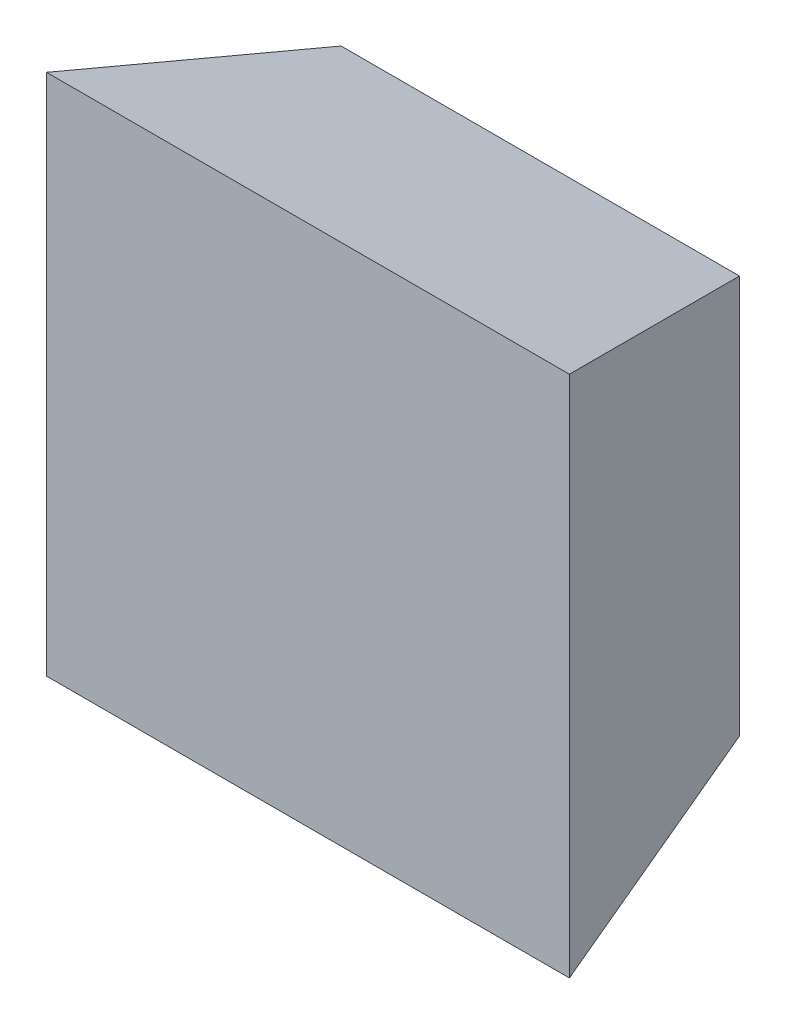
ISO-10303-21;
HEADER;
FILE_DESCRIPTION(('STEP AP214'),'2;1');
FILE_NAME('part.step','',(''),(''),'','','');
FILE_SCHEMA(('AUTOMOTIVE_DESIGN { 1 0 10303 214 1 1 1 1 }'));
ENDSEC;
DATA;
#1=APPLICATION_CONTEXT('core data for automotive mechanical design processes');
#2=APPLICATION_PROTOCOL_DEFINITION('international standard','automotive_design',2000,#1);
#3=PRODUCT_CONTEXT('',#1,'mechanical');
#4=PRODUCT('Part','Part','',(#3));
#5=PRODUCT_RELATED_PRODUCT_CATEGORY('part','',(#4));
#6=PRODUCT_DEFINITION_FORMATION('','',#4);
#7=PRODUCT_DEFINITION_CONTEXT('part definition',#1,'design');
#8=PRODUCT_DEFINITION('design','',#6,#7);
#9=PRODUCT_DEFINITION_SHAPE('','',#8);
#10=(LENGTH_UNIT() NAMED_UNIT(*) SI_UNIT(.MILLI.,.METRE.));
#11=(NAMED_UNIT(*) PLANE_ANGLE_UNIT() SI_UNIT($,.RADIAN.));
#12=(NAMED_UNIT(*) SI_UNIT($,.STERADIAN.) SOLID_ANGLE_UNIT());
#13=UNCERTAINTY_MEASURE_WITH_UNIT(LENGTH_MEASURE(1.E-05),#10,'distance_accuracy_value','');
#14=(GEOMETRIC_REPRESENTATION_CONTEXT(3) GLOBAL_UNCERTAINTY_ASSIGNED_CONTEXT((#13)) GLOBAL_UNIT_ASSIGNED_CONTEXT((#10,
#11,#12)) REPRESENTATION_CONTEXT('',''));
#15=CARTESIAN_POINT('',(0.,0.,0.));
#16=DIRECTION('',(0.,0.,1.));
#17=DIRECTION('',(1.,0.,0.));
#18=AXIS2_PLACEMENT_3D('',#15,#16,#17);
#19=CARTESIAN_POINT('',(-12.7,-12.7,0.));
#20=DIRECTION('',(0.,-0.965925826289068,-0.258819045102521));
#21=DIRECTION('',(0.,0.258819045102521,-0.965925826289068));
#22=AXIS2_PLACEMENT_3D('',#19,#20,#21);
#23=PLANE('',#22);
#24=DIRECTION('',(1.,0.,0.));
#25=VECTOR('',#24,1.);
#26=CARTESIAN_POINT('',(-12.7,-12.7,0.));
#27=LINE('',#26,#25);
#28=CARTESIAN_POINT('',(-12.7,-12.7,0.));
#29=VERTEX_POINT('',#28);
#30=CARTESIAN_POINT('',(12.7,-12.7,0.));
#31=VERTEX_POINT('',#30);
#32=EDGE_CURVE('E99',#29,#31,#27,.T.);
#33=ORIENTED_EDGE('',*,*,#32,.T.);
#34=DIRECTION('',(-0.250562807085732,0.250562807085732,-0.935113126531029));
#35=VECTOR('',#34,1.);
#36=CARTESIAN_POINT('',(12.7,-12.7,0.));
#37=LINE('',#36,#35);
#38=CARTESIAN_POINT('',(16.6698870042049,-16.6698870042049,14.81582));
#39=VERTEX_POINT('',#38);
#40=EDGE_CURVE('E92',#39,#31,#37,.T.);
#41=ORIENTED_EDGE('',*,*,#40,.F.);
#42=DIRECTION('',(-1.,0.,0.));
#43=VECTOR('',#42,1.);
#44=CARTESIAN_POINT('',(0.,-16.6698870042049,14.81582));
#45=LINE('',#44,#43);
#46=CARTESIAN_POINT('',(-16.6698870042049,-16.6698870042049,14.81582));
#47=VERTEX_POINT('',#46);
#48=EDGE_CURVE('E50',#47,#39,#45,.F.);
#49=ORIENTED_EDGE('',*,*,#48,.F.);
#50=DIRECTION('',(0.250562807085732,0.250562807085732,-0.935113126531029));
#51=VECTOR('',#50,1.);
#52=CARTESIAN_POINT('',(-12.7,-12.7,0.));
#53=LINE('',#52,#51);
#54=EDGE_CURVE('E103',#47,#29,#53,.T.);
#55=ORIENTED_EDGE('',*,*,#54,.T.);
#56=EDGE_LOOP('',(#33,#41,#49,#55));
#57=FACE_BOUND('',#56,.T.);
#58=CARTESIAN_POINT('',(0.,-14.6849435021025,7.40791));
#59=DIRECTION('',(0.,-0.965925826289068,-0.258819045102521));
#60=DIRECTION('',(0.,-0.258819045102521,0.965925826289068));
#61=AXIS2_PLACEMENT_3D('',#58,#59,#60);
#62=ELLIPSE('',#61,1.72567598322106,1.666875);
#63=CARTESIAN_POINT('',(0.,-15.1315813122361,9.074785));
#64=VERTEX_POINT('',#63);
#65=EDGE_CURVE('E37',#64,#64,#62,.T.);
#66=ORIENTED_EDGE('',*,*,#65,.F.);
#67=EDGE_LOOP('',(#66));
#68=FACE_BOUND('',#67,.T.);
#69=ADVANCED_FACE('F33',(#57,#68),#23,.T.);
#70=CARTESIAN_POINT('',(12.7,-12.7,0.));
#71=DIRECTION('',(0.965925826289068,0.,-0.258819045102521));
#72=DIRECTION('',(-0.258819045102521,0.,-0.965925826289068));
#73=AXIS2_PLACEMENT_3D('',#70,#71,#72);
#74=PLANE('',#73);
#75=DIRECTION('',(0.,1.,0.));
#76=VECTOR('',#75,1.);
#77=CARTESIAN_POINT('',(12.7,-12.7,0.));
#78=LINE('',#77,#76);
#79=CARTESIAN_POINT('',(12.7,12.7,0.));
#80=VERTEX_POINT('',#79);
#81=EDGE_CURVE('E80',#31,#80,#78,.T.);
#82=ORIENTED_EDGE('',*,*,#81,.T.);
#83=DIRECTION('',(-0.250562807085732,-0.250562807085732,-0.935113126531029));
#84=VECTOR('',#83,1.);
#85=CARTESIAN_POINT('',(11.1053443045151,11.1053443045151,-5.95133607612878));
#86=LINE('',#85,#84);
#87=CARTESIAN_POINT('',(16.6698870042049,16.6698870042049,14.81582));
#88=VERTEX_POINT('',#87);
#89=EDGE_CURVE('E11',#88,#80,#86,.T.);
#90=ORIENTED_EDGE('',*,*,#89,.F.);
#91=DIRECTION('',(0.,-1.,0.));
#92=VECTOR('',#91,1.);
#93=CARTESIAN_POINT('',(16.6698870042049,0.,14.81582));
#94=LINE('',#93,#92);
#95=EDGE_CURVE('E100',#39,#88,#94,.F.);
#96=ORIENTED_EDGE('',*,*,#95,.F.);
#97=ORIENTED_EDGE('',*,*,#40,.T.);
#98=EDGE_LOOP('',(#82,#90,#96,#97));
#99=FACE_BOUND('',#98,.T.);
#100=ADVANCED_FACE('F91',(#99),#74,.T.);
#101=CARTESIAN_POINT('',(-12.7,12.7,0.));
#102=DIRECTION('',(0.,0.965925826289068,-0.258819045102521));
#103=DIRECTION('',(0.,0.258819045102521,0.965925826289068));
#104=AXIS2_PLACEMENT_3D('',#101,#102,#103);
#105=PLANE('',#104);
#106=DIRECTION('',(-1.,0.,0.));
#107=VECTOR('',#106,1.);
#108=CARTESIAN_POINT('',(-12.7,12.7,0.));
#109=LINE('',#108,#107);
#110=CARTESIAN_POINT('',(-12.7,12.7,0.));
#111=VERTEX_POINT('',#110);
#112=EDGE_CURVE('E76',#80,#111,#109,.T.);
#113=ORIENTED_EDGE('',*,*,#112,.T.);
#114=DIRECTION('',(0.250562807085732,-0.250562807085732,-0.935113126531029));
#115=VECTOR('',#114,1.);
#116=CARTESIAN_POINT('',(-11.1053443045151,11.1053443045151,-5.95133607612878));
#117=LINE('',#116,#115);
#118=CARTESIAN_POINT('',(-16.6698870042049,16.6698870042049,14.81582));
#119=VERTEX_POINT('',#118);
#120=EDGE_CURVE('E42',#119,#111,#117,.T.);
#121=ORIENTED_EDGE('',*,*,#120,.F.);
#122=DIRECTION('',(1.,0.,0.));
#123=VECTOR('',#122,1.);
#124=CARTESIAN_POINT('',(0.,16.6698870042049,14.81582));
#125=LINE('',#124,#123);
#126=EDGE_CURVE('E87',#88,#119,#125,.F.);
#127=ORIENTED_EDGE('',*,*,#126,.F.);
#128=ORIENTED_EDGE('',*,*,#89,.T.);
#129=EDGE_LOOP('',(#113,#121,#127,#128));
#130=FACE_BOUND('',#129,.T.);
#131=ADVANCED_FACE('F35',(#130),#105,.T.);
#132=CARTESIAN_POINT('',(-12.7,-12.7,0.));
#133=DIRECTION('',(-0.965925826289068,0.,-0.258819045102521));
#134=DIRECTION('',(-0.258819045102521,0.,0.965925826289068));
#135=AXIS2_PLACEMENT_3D('',#132,#133,#134);
#136=PLANE('',#135);
#137=DIRECTION('',(0.,-1.,0.));
#138=VECTOR('',#137,1.);
#139=CARTESIAN_POINT('',(-12.7,-12.7,0.));
#140=LINE('',#139,#138);
#141=EDGE_CURVE('E81',#111,#29,#140,.T.);
#142=ORIENTED_EDGE('',*,*,#141,.T.);
#143=ORIENTED_EDGE('',*,*,#54,.F.);
#144=DIRECTION('',(0.,1.,0.));
#145=VECTOR('',#144,1.);
#146=CARTESIAN_POINT('',(-16.6698870042049,0.,14.81582));
#147=LINE('',#146,#145);
#148=EDGE_CURVE('E55',#119,#47,#147,.F.);
#149=ORIENTED_EDGE('',*,*,#148,.F.);
#150=ORIENTED_EDGE('',*,*,#120,.T.);
#151=EDGE_LOOP('',(#142,#143,#149,#150));
#152=FACE_BOUND('',#151,.T.);
#153=ADVANCED_FACE('F111',(#152),#136,.T.);
#154=CARTESIAN_POINT('',(0.,0.,14.81582));
#155=DIRECTION('',(0.,0.,-1.));
#156=DIRECTION('',(-1.,0.,0.));
#157=AXIS2_PLACEMENT_3D('',#154,#155,#156);
#158=PLANE('',#157);
#159=ORIENTED_EDGE('',*,*,#95,.T.);
#160=ORIENTED_EDGE('',*,*,#126,.T.);
#161=ORIENTED_EDGE('',*,*,#148,.T.);
#162=ORIENTED_EDGE('',*,*,#48,.T.);
#163=EDGE_LOOP('',(#159,#160,#161,#162));
#164=FACE_BOUND('',#163,.T.);
#165=ADVANCED_FACE('F109',(#164),#158,.F.);
#166=CARTESIAN_POINT('',(0.,0.,0.));
#167=DIRECTION('',(0.,0.,-1.));
#168=DIRECTION('',(-1.,0.,0.));
#169=AXIS2_PLACEMENT_3D('',#166,#167,#168);
#170=PLANE('',#169);
#171=ORIENTED_EDGE('',*,*,#81,.F.);
#172=ORIENTED_EDGE('',*,*,#32,.F.);
#173=ORIENTED_EDGE('',*,*,#141,.F.);
#174=ORIENTED_EDGE('',*,*,#112,.F.);
#175=EDGE_LOOP('',(#171,#172,#173,#174));
#176=FACE_BOUND('',#175,.T.);
#177=ADVANCED_FACE('F77',(#176),#170,.T.);
#178=CARTESIAN_POINT('',(0.,-5.08,7.40791));
#179=DIRECTION('',(0.,-1.,0.));
#180=DIRECTION('',(0.,0.,-1.));
#181=AXIS2_PLACEMENT_3D('',#178,#179,#180);
#182=CYLINDRICAL_SURFACE('',#181,1.666875);
#183=CARTESIAN_POINT('',(0.,-5.08,7.40791));
#184=DIRECTION('',(0.,1.,0.));
#185=DIRECTION('',(0.,0.,1.));
#186=AXIS2_PLACEMENT_3D('',#183,#184,#185);
#187=CIRCLE('',#186,1.666875);
#188=CARTESIAN_POINT('',(0.,-5.08,9.074785));
#189=VERTEX_POINT('',#188);
#190=EDGE_CURVE('E95',#189,#189,#187,.T.);
#191=ORIENTED_EDGE('',*,*,#190,.T.);
#192=EDGE_LOOP('',(#191));
#193=FACE_BOUND('',#192,.T.);
#194=ORIENTED_EDGE('',*,*,#65,.T.);
#195=EDGE_LOOP('',(#194));
#196=FACE_BOUND('',#195,.T.);
#197=ADVANCED_FACE('F118',(#193,#196),#182,.F.);
#198=CARTESIAN_POINT('',(0.,-5.08,0.));
#199=DIRECTION('',(0.,1.,0.));
#200=DIRECTION('',(0.,0.,1.));
#201=AXIS2_PLACEMENT_3D('',#198,#199,#200);
#202=PLANE('',#201);
#203=ORIENTED_EDGE('',*,*,#190,.F.);
#204=EDGE_LOOP('',(#203));
#205=FACE_BOUND('',#204,.T.);
#206=ADVANCED_FACE('F120',(#205),#202,.F.);
#207=CLOSED_SHELL('',(#69,#100,#131,#153,#165,#177,#197,#206));
#208=MANIFOLD_SOLID_BREP('B2',#207);
#209=ADVANCED_BREP_SHAPE_REPRESENTATION('',(#18,#208),#14);
#210=SHAPE_DEFINITION_REPRESENTATION(#9,#209);
ENDSEC;
END-ISO-10303-21;
